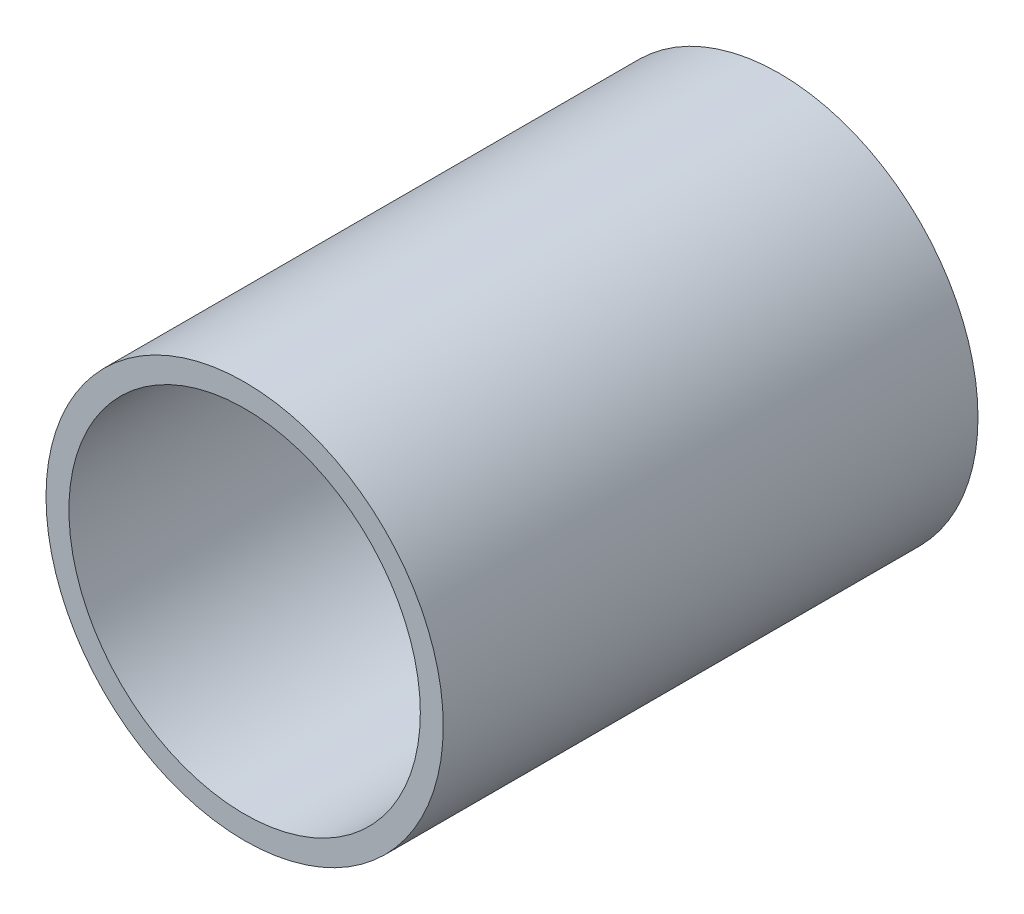
ISO-10303-21;
HEADER;
FILE_DESCRIPTION(('STEP AP214'),'2;1');
FILE_NAME('part.step','',(''),(''),'','','');
FILE_SCHEMA(('AUTOMOTIVE_DESIGN { 1 0 10303 214 1 1 1 1 }'));
ENDSEC;
DATA;
#1=APPLICATION_CONTEXT('core data for automotive mechanical design processes');
#2=APPLICATION_PROTOCOL_DEFINITION('international standard','automotive_design',2000,#1);
#3=PRODUCT_CONTEXT('',#1,'mechanical');
#4=PRODUCT('Part','Part','',(#3));
#5=PRODUCT_RELATED_PRODUCT_CATEGORY('part','',(#4));
#6=PRODUCT_DEFINITION_FORMATION('','',#4);
#7=PRODUCT_DEFINITION_CONTEXT('part definition',#1,'design');
#8=PRODUCT_DEFINITION('design','',#6,#7);
#9=PRODUCT_DEFINITION_SHAPE('','',#8);
#10=(LENGTH_UNIT() NAMED_UNIT(*) SI_UNIT(.MILLI.,.METRE.));
#11=(NAMED_UNIT(*) PLANE_ANGLE_UNIT() SI_UNIT($,.RADIAN.));
#12=(NAMED_UNIT(*) SI_UNIT($,.STERADIAN.) SOLID_ANGLE_UNIT());
#13=UNCERTAINTY_MEASURE_WITH_UNIT(LENGTH_MEASURE(1.E-05),#10,'distance_accuracy_value','');
#14=(GEOMETRIC_REPRESENTATION_CONTEXT(3) GLOBAL_UNCERTAINTY_ASSIGNED_CONTEXT((#13)) GLOBAL_UNIT_ASSIGNED_CONTEXT((#10,
#11,#12)) REPRESENTATION_CONTEXT('',''));
#15=CARTESIAN_POINT('',(0.,0.,0.));
#16=DIRECTION('',(0.,0.,1.));
#17=DIRECTION('',(1.,0.,0.));
#18=AXIS2_PLACEMENT_3D('',#15,#16,#17);
#19=CARTESIAN_POINT('',(0.,0.,70.));
#20=DIRECTION('',(0.,0.,1.));
#21=DIRECTION('',(1.,0.,0.));
#22=AXIS2_PLACEMENT_3D('',#19,#20,#21);
#23=PLANE('',#22);
#24=CARTESIAN_POINT('',(0.,0.,70.));
#25=DIRECTION('',(0.,0.,1.));
#26=DIRECTION('',(1.,0.,0.));
#27=AXIS2_PLACEMENT_3D('',#24,#25,#26);
#28=CIRCLE('',#27,26.);
#29=CARTESIAN_POINT('',(26.,0.,70.));
#30=VERTEX_POINT('',#29);
#31=EDGE_CURVE('E10',#30,#30,#28,.T.);
#32=ORIENTED_EDGE('',*,*,#31,.T.);
#33=EDGE_LOOP('',(#32));
#34=FACE_BOUND('',#33,.T.);
#35=CARTESIAN_POINT('',(0.,0.,70.));
#36=DIRECTION('',(0.,0.,1.));
#37=DIRECTION('',(1.,0.,0.));
#38=AXIS2_PLACEMENT_3D('',#35,#36,#37);
#39=CIRCLE('',#38,23.);
#40=CARTESIAN_POINT('',(23.,0.,70.));
#41=VERTEX_POINT('',#40);
#42=EDGE_CURVE('E54',#41,#41,#39,.T.);
#43=ORIENTED_EDGE('',*,*,#42,.F.);
#44=EDGE_LOOP('',(#43));
#45=FACE_BOUND('',#44,.T.);
#46=ADVANCED_FACE('F41',(#34,#45),#23,.T.);
#47=CARTESIAN_POINT('',(0.,0.,0.));
#48=DIRECTION('',(0.,0.,1.));
#49=DIRECTION('',(1.,0.,0.));
#50=AXIS2_PLACEMENT_3D('',#47,#48,#49);
#51=PLANE('',#50);
#52=CARTESIAN_POINT('',(0.,0.,0.));
#53=DIRECTION('',(0.,0.,1.));
#54=DIRECTION('',(1.,0.,0.));
#55=AXIS2_PLACEMENT_3D('',#52,#53,#54);
#56=CIRCLE('',#55,26.);
#57=CARTESIAN_POINT('',(26.,0.,0.));
#58=VERTEX_POINT('',#57);
#59=EDGE_CURVE('E45',#58,#58,#56,.T.);
#60=ORIENTED_EDGE('',*,*,#59,.F.);
#61=EDGE_LOOP('',(#60));
#62=FACE_BOUND('',#61,.T.);
#63=CARTESIAN_POINT('',(0.,0.,0.));
#64=DIRECTION('',(0.,0.,1.));
#65=DIRECTION('',(1.,0.,0.));
#66=AXIS2_PLACEMENT_3D('',#63,#64,#65);
#67=CIRCLE('',#66,23.);
#68=CARTESIAN_POINT('',(23.,0.,0.));
#69=VERTEX_POINT('',#68);
#70=EDGE_CURVE('E56',#69,#69,#67,.T.);
#71=ORIENTED_EDGE('',*,*,#70,.T.);
#72=EDGE_LOOP('',(#71));
#73=FACE_BOUND('',#72,.T.);
#74=ADVANCED_FACE('F68',(#62,#73),#51,.F.);
#75=CARTESIAN_POINT('',(0.,0.,70.));
#76=DIRECTION('',(0.,0.,-1.));
#77=DIRECTION('',(-1.,0.,0.));
#78=AXIS2_PLACEMENT_3D('',#75,#76,#77);
#79=CYLINDRICAL_SURFACE('',#78,26.);
#80=ORIENTED_EDGE('',*,*,#31,.F.);
#81=EDGE_LOOP('',(#80));
#82=FACE_BOUND('',#81,.T.);
#83=ORIENTED_EDGE('',*,*,#59,.T.);
#84=EDGE_LOOP('',(#83));
#85=FACE_BOUND('',#84,.T.);
#86=ADVANCED_FACE('F43',(#82,#85),#79,.T.);
#87=CARTESIAN_POINT('',(0.,0.,70.));
#88=DIRECTION('',(0.,0.,-1.));
#89=DIRECTION('',(-1.,0.,0.));
#90=AXIS2_PLACEMENT_3D('',#87,#88,#89);
#91=CYLINDRICAL_SURFACE('',#90,23.);
#92=ORIENTED_EDGE('',*,*,#42,.T.);
#93=EDGE_LOOP('',(#92));
#94=FACE_BOUND('',#93,.T.);
#95=ORIENTED_EDGE('',*,*,#70,.F.);
#96=EDGE_LOOP('',(#95));
#97=FACE_BOUND('',#96,.T.);
#98=ADVANCED_FACE('F64',(#94,#97),#91,.F.);
#99=CLOSED_SHELL('',(#46,#74,#86,#98));
#100=MANIFOLD_SOLID_BREP('B2',#99);
#101=ADVANCED_BREP_SHAPE_REPRESENTATION('',(#18,#100),#14);
#102=SHAPE_DEFINITION_REPRESENTATION(#9,#101);
ENDSEC;
END-ISO-10303-21;
